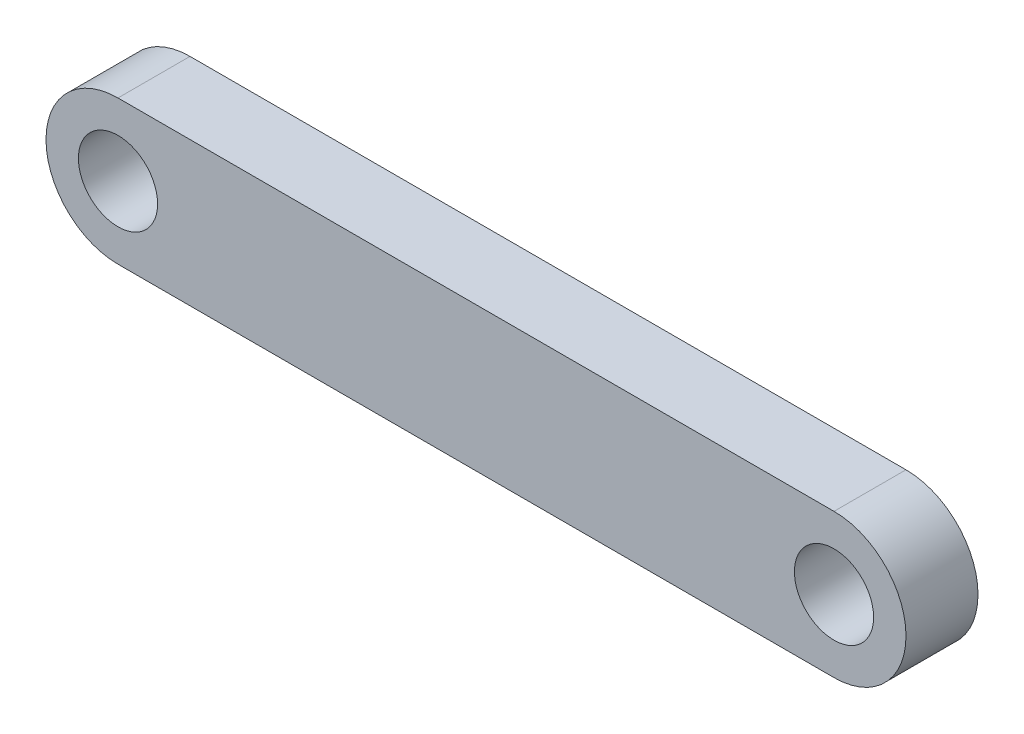
ISO-10303-21;
HEADER;
FILE_DESCRIPTION(('STEP AP214'),'2;1');
FILE_NAME('part.step','',(''),(''),'','','');
FILE_SCHEMA(('AUTOMOTIVE_DESIGN { 1 0 10303 214 1 1 1 1 }'));
ENDSEC;
DATA;
#1=APPLICATION_CONTEXT('core data for automotive mechanical design processes');
#2=APPLICATION_PROTOCOL_DEFINITION('international standard','automotive_design',2000,#1);
#3=PRODUCT_CONTEXT('',#1,'mechanical');
#4=PRODUCT('Part','Part','',(#3));
#5=PRODUCT_RELATED_PRODUCT_CATEGORY('part','',(#4));
#6=PRODUCT_DEFINITION_FORMATION('','',#4);
#7=PRODUCT_DEFINITION_CONTEXT('part definition',#1,'design');
#8=PRODUCT_DEFINITION('design','',#6,#7);
#9=PRODUCT_DEFINITION_SHAPE('','',#8);
#10=(LENGTH_UNIT() NAMED_UNIT(*) SI_UNIT(.MILLI.,.METRE.));
#11=(NAMED_UNIT(*) PLANE_ANGLE_UNIT() SI_UNIT($,.RADIAN.));
#12=(NAMED_UNIT(*) SI_UNIT($,.STERADIAN.) SOLID_ANGLE_UNIT());
#13=UNCERTAINTY_MEASURE_WITH_UNIT(LENGTH_MEASURE(1.E-05),#10,'distance_accuracy_value','');
#14=(GEOMETRIC_REPRESENTATION_CONTEXT(3) GLOBAL_UNCERTAINTY_ASSIGNED_CONTEXT((#13)) GLOBAL_UNIT_ASSIGNED_CONTEXT((#10,
#11,#12)) REPRESENTATION_CONTEXT('',''));
#15=CARTESIAN_POINT('',(0.,0.,0.));
#16=DIRECTION('',(0.,0.,1.));
#17=DIRECTION('',(1.,0.,0.));
#18=AXIS2_PLACEMENT_3D('',#15,#16,#17);
#19=CARTESIAN_POINT('',(-14.9170683628168,0.0493717384785629,3.));
#20=DIRECTION('',(0.,0.,1.));
#21=DIRECTION('',(1.,0.,0.));
#22=AXIS2_PLACEMENT_3D('',#19,#20,#21);
#23=PLANE('',#22);
#24=CARTESIAN_POINT('',(-14.9170683628168,0.0493717384785629,3.));
#25=DIRECTION('',(0.,0.,1.));
#26=DIRECTION('',(1.,0.,0.));
#27=AXIS2_PLACEMENT_3D('',#24,#25,#26);
#28=CIRCLE('',#27,1.65);
#29=CARTESIAN_POINT('',(-13.2670683628168,0.0493717384785629,3.));
#30=VERTEX_POINT('',#29);
#31=EDGE_CURVE('E107',#30,#30,#28,.T.);
#32=ORIENTED_EDGE('',*,*,#31,.F.);
#33=EDGE_LOOP('',(#32));
#34=FACE_BOUND('',#33,.T.);
#35=CARTESIAN_POINT('',(-14.9170683628168,0.0493717384785629,3.));
#36=DIRECTION('',(0.,0.,1.));
#37=DIRECTION('',(1.,0.,0.));
#38=AXIS2_PLACEMENT_3D('',#35,#36,#37);
#39=CIRCLE('',#38,3.);
#40=CARTESIAN_POINT('',(-14.9170683628168,3.04937173847856,3.));
#41=VERTEX_POINT('',#40);
#42=CARTESIAN_POINT('',(-14.9170683628168,-2.95062826152144,3.));
#43=VERTEX_POINT('',#42);
#44=EDGE_CURVE('E92',#41,#43,#39,.T.);
#45=ORIENTED_EDGE('',*,*,#44,.T.);
#46=DIRECTION('',(1.,0.,0.));
#47=VECTOR('',#46,1.);
#48=CARTESIAN_POINT('',(14.9170683628168,-2.95062826152144,3.));
#49=LINE('',#48,#47);
#50=CARTESIAN_POINT('',(14.9170683628168,-2.95062826152144,3.));
#51=VERTEX_POINT('',#50);
#52=EDGE_CURVE('E87',#43,#51,#49,.T.);
#53=ORIENTED_EDGE('',*,*,#52,.T.);
#54=CARTESIAN_POINT('',(14.9170683628168,0.0493717384785629,3.));
#55=DIRECTION('',(0.,0.,1.));
#56=DIRECTION('',(1.,0.,0.));
#57=AXIS2_PLACEMENT_3D('',#54,#55,#56);
#58=CIRCLE('',#57,3.);
#59=CARTESIAN_POINT('',(14.9170683628168,3.04937173847856,3.));
#60=VERTEX_POINT('',#59);
#61=EDGE_CURVE('E90',#51,#60,#58,.T.);
#62=ORIENTED_EDGE('',*,*,#61,.T.);
#63=DIRECTION('',(-1.,0.,0.));
#64=VECTOR('',#63,1.);
#65=CARTESIAN_POINT('',(-14.9170683628168,3.04937173847856,3.));
#66=LINE('',#65,#64);
#67=EDGE_CURVE('E57',#60,#41,#66,.T.);
#68=ORIENTED_EDGE('',*,*,#67,.T.);
#69=EDGE_LOOP('',(#45,#53,#62,#68));
#70=FACE_BOUND('',#69,.T.);
#71=CARTESIAN_POINT('',(14.9170683628168,0.0493717384785629,3.));
#72=DIRECTION('',(0.,0.,1.));
#73=DIRECTION('',(1.,0.,0.));
#74=AXIS2_PLACEMENT_3D('',#71,#72,#73);
#75=CIRCLE('',#74,1.65);
#76=CARTESIAN_POINT('',(16.5670683628168,0.0493717384785629,3.));
#77=VERTEX_POINT('',#76);
#78=EDGE_CURVE('E122',#77,#77,#75,.T.);
#79=ORIENTED_EDGE('',*,*,#78,.F.);
#80=EDGE_LOOP('',(#79));
#81=FACE_BOUND('',#80,.T.);
#82=ADVANCED_FACE('F40',(#34,#70,#81),#23,.T.);
#83=CARTESIAN_POINT('',(-14.9170683628168,0.0493717384785629,0.));
#84=DIRECTION('',(0.,0.,1.));
#85=DIRECTION('',(1.,0.,0.));
#86=AXIS2_PLACEMENT_3D('',#83,#84,#85);
#87=PLANE('',#86);
#88=CARTESIAN_POINT('',(-14.9170683628168,0.0493717384785629,0.));
#89=DIRECTION('',(0.,0.,1.));
#90=DIRECTION('',(1.,0.,0.));
#91=AXIS2_PLACEMENT_3D('',#88,#89,#90);
#92=CIRCLE('',#91,3.);
#93=CARTESIAN_POINT('',(-14.9170683628168,3.04937173847856,0.));
#94=VERTEX_POINT('',#93);
#95=CARTESIAN_POINT('',(-14.9170683628168,-2.95062826152144,0.));
#96=VERTEX_POINT('',#95);
#97=EDGE_CURVE('E104',#94,#96,#92,.T.);
#98=ORIENTED_EDGE('',*,*,#97,.F.);
#99=DIRECTION('',(-1.,0.,0.));
#100=VECTOR('',#99,1.);
#101=CARTESIAN_POINT('',(-14.9170683628168,3.04937173847856,0.));
#102=LINE('',#101,#100);
#103=CARTESIAN_POINT('',(14.9170683628168,3.04937173847856,0.));
#104=VERTEX_POINT('',#103);
#105=EDGE_CURVE('E80',#104,#94,#102,.T.);
#106=ORIENTED_EDGE('',*,*,#105,.F.);
#107=CARTESIAN_POINT('',(14.9170683628168,0.0493717384785629,0.));
#108=DIRECTION('',(0.,0.,1.));
#109=DIRECTION('',(1.,0.,0.));
#110=AXIS2_PLACEMENT_3D('',#107,#108,#109);
#111=CIRCLE('',#110,3.);
#112=CARTESIAN_POINT('',(14.9170683628168,-2.95062826152144,0.));
#113=VERTEX_POINT('',#112);
#114=EDGE_CURVE('E74',#113,#104,#111,.T.);
#115=ORIENTED_EDGE('',*,*,#114,.F.);
#116=DIRECTION('',(1.,0.,0.));
#117=VECTOR('',#116,1.);
#118=CARTESIAN_POINT('',(14.9170683628168,-2.95062826152144,0.));
#119=LINE('',#118,#117);
#120=EDGE_CURVE('E96',#96,#113,#119,.T.);
#121=ORIENTED_EDGE('',*,*,#120,.F.);
#122=EDGE_LOOP('',(#98,#106,#115,#121));
#123=FACE_BOUND('',#122,.T.);
#124=CARTESIAN_POINT('',(-14.9170683628168,0.0493717384785629,0.));
#125=DIRECTION('',(0.,0.,1.));
#126=DIRECTION('',(1.,0.,0.));
#127=AXIS2_PLACEMENT_3D('',#124,#125,#126);
#128=CIRCLE('',#127,1.65);
#129=CARTESIAN_POINT('',(-13.2670683628168,0.0493717384785629,0.));
#130=VERTEX_POINT('',#129);
#131=EDGE_CURVE('E119',#130,#130,#128,.T.);
#132=ORIENTED_EDGE('',*,*,#131,.T.);
#133=EDGE_LOOP('',(#132));
#134=FACE_BOUND('',#133,.T.);
#135=CARTESIAN_POINT('',(14.9170683628168,0.0493717384785629,0.));
#136=DIRECTION('',(0.,0.,1.));
#137=DIRECTION('',(1.,0.,0.));
#138=AXIS2_PLACEMENT_3D('',#135,#136,#137);
#139=CIRCLE('',#138,1.65);
#140=CARTESIAN_POINT('',(16.5670683628168,0.0493717384785629,0.));
#141=VERTEX_POINT('',#140);
#142=EDGE_CURVE('E125',#141,#141,#139,.T.);
#143=ORIENTED_EDGE('',*,*,#142,.T.);
#144=EDGE_LOOP('',(#143));
#145=FACE_BOUND('',#144,.T.);
#146=ADVANCED_FACE('F115',(#123,#134,#145),#87,.F.);
#147=CARTESIAN_POINT('',(-14.9170683628168,0.0493717384785629,3.));
#148=DIRECTION('',(0.,0.,-1.));
#149=DIRECTION('',(-1.,0.,0.));
#150=AXIS2_PLACEMENT_3D('',#147,#148,#149);
#151=CYLINDRICAL_SURFACE('',#150,3.);
#152=ORIENTED_EDGE('',*,*,#97,.T.);
#153=DIRECTION('',(0.,0.,-1.));
#154=VECTOR('',#153,1.);
#155=CARTESIAN_POINT('',(-14.9170683628168,-2.95062826152144,3.));
#156=LINE('',#155,#154);
#157=EDGE_CURVE('E11',#43,#96,#156,.T.);
#158=ORIENTED_EDGE('',*,*,#157,.F.);
#159=ORIENTED_EDGE('',*,*,#44,.F.);
#160=DIRECTION('',(0.,0.,-1.));
#161=VECTOR('',#160,1.);
#162=CARTESIAN_POINT('',(-14.9170683628168,3.04937173847856,3.));
#163=LINE('',#162,#161);
#164=EDGE_CURVE('E100',#41,#94,#163,.T.);
#165=ORIENTED_EDGE('',*,*,#164,.T.);
#166=EDGE_LOOP('',(#152,#158,#159,#165));
#167=FACE_BOUND('',#166,.T.);
#168=ADVANCED_FACE('F42',(#167),#151,.T.);
#169=CARTESIAN_POINT('',(14.9170683628168,-2.95062826152144,3.));
#170=DIRECTION('',(0.,1.,0.));
#171=DIRECTION('',(0.,0.,1.));
#172=AXIS2_PLACEMENT_3D('',#169,#170,#171);
#173=PLANE('',#172);
#174=ORIENTED_EDGE('',*,*,#120,.T.);
#175=DIRECTION('',(0.,0.,-1.));
#176=VECTOR('',#175,1.);
#177=CARTESIAN_POINT('',(14.9170683628168,-2.95062826152144,3.));
#178=LINE('',#177,#176);
#179=EDGE_CURVE('E49',#51,#113,#178,.T.);
#180=ORIENTED_EDGE('',*,*,#179,.F.);
#181=ORIENTED_EDGE('',*,*,#52,.F.);
#182=ORIENTED_EDGE('',*,*,#157,.T.);
#183=EDGE_LOOP('',(#174,#180,#181,#182));
#184=FACE_BOUND('',#183,.T.);
#185=ADVANCED_FACE('F95',(#184),#173,.F.);
#186=CARTESIAN_POINT('',(14.9170683628168,0.0493717384785629,3.));
#187=DIRECTION('',(0.,0.,-1.));
#188=DIRECTION('',(-1.,0.,0.));
#189=AXIS2_PLACEMENT_3D('',#186,#187,#188);
#190=CYLINDRICAL_SURFACE('',#189,3.);
#191=ORIENTED_EDGE('',*,*,#114,.T.);
#192=DIRECTION('',(0.,0.,-1.));
#193=VECTOR('',#192,1.);
#194=CARTESIAN_POINT('',(14.9170683628168,3.04937173847856,3.));
#195=LINE('',#194,#193);
#196=EDGE_CURVE('E97',#60,#104,#195,.T.);
#197=ORIENTED_EDGE('',*,*,#196,.F.);
#198=ORIENTED_EDGE('',*,*,#61,.F.);
#199=ORIENTED_EDGE('',*,*,#179,.T.);
#200=EDGE_LOOP('',(#191,#197,#198,#199));
#201=FACE_BOUND('',#200,.T.);
#202=ADVANCED_FACE('F98',(#201),#190,.T.);
#203=CARTESIAN_POINT('',(-14.9170683628168,3.04937173847856,3.));
#204=DIRECTION('',(0.,-1.,0.));
#205=DIRECTION('',(0.,0.,-1.));
#206=AXIS2_PLACEMENT_3D('',#203,#204,#205);
#207=PLANE('',#206);
#208=ORIENTED_EDGE('',*,*,#105,.T.);
#209=ORIENTED_EDGE('',*,*,#164,.F.);
#210=ORIENTED_EDGE('',*,*,#67,.F.);
#211=ORIENTED_EDGE('',*,*,#196,.T.);
#212=EDGE_LOOP('',(#208,#209,#210,#211));
#213=FACE_BOUND('',#212,.T.);
#214=ADVANCED_FACE('F112',(#213),#207,.F.);
#215=CARTESIAN_POINT('',(-14.9170683628168,0.0493717384785629,3.));
#216=DIRECTION('',(0.,0.,-1.));
#217=DIRECTION('',(-1.,0.,0.));
#218=AXIS2_PLACEMENT_3D('',#215,#216,#217);
#219=CYLINDRICAL_SURFACE('',#218,1.65);
#220=ORIENTED_EDGE('',*,*,#31,.T.);
#221=EDGE_LOOP('',(#220));
#222=FACE_BOUND('',#221,.T.);
#223=ORIENTED_EDGE('',*,*,#131,.F.);
#224=EDGE_LOOP('',(#223));
#225=FACE_BOUND('',#224,.T.);
#226=ADVANCED_FACE('F142',(#222,#225),#219,.F.);
#227=CARTESIAN_POINT('',(14.9170683628168,0.0493717384785629,3.));
#228=DIRECTION('',(0.,0.,-1.));
#229=DIRECTION('',(-1.,0.,0.));
#230=AXIS2_PLACEMENT_3D('',#227,#228,#229);
#231=CYLINDRICAL_SURFACE('',#230,1.65);
#232=ORIENTED_EDGE('',*,*,#78,.T.);
#233=EDGE_LOOP('',(#232));
#234=FACE_BOUND('',#233,.T.);
#235=ORIENTED_EDGE('',*,*,#142,.F.);
#236=EDGE_LOOP('',(#235));
#237=FACE_BOUND('',#236,.T.);
#238=ADVANCED_FACE('F131',(#234,#237),#231,.F.);
#239=CLOSED_SHELL('',(#82,#146,#168,#185,#202,#214,#226,#238));
#240=MANIFOLD_SOLID_BREP('B2',#239);
#241=ADVANCED_BREP_SHAPE_REPRESENTATION('',(#18,#240),#14);
#242=SHAPE_DEFINITION_REPRESENTATION(#9,#241);
ENDSEC;
END-ISO-10303-21;
